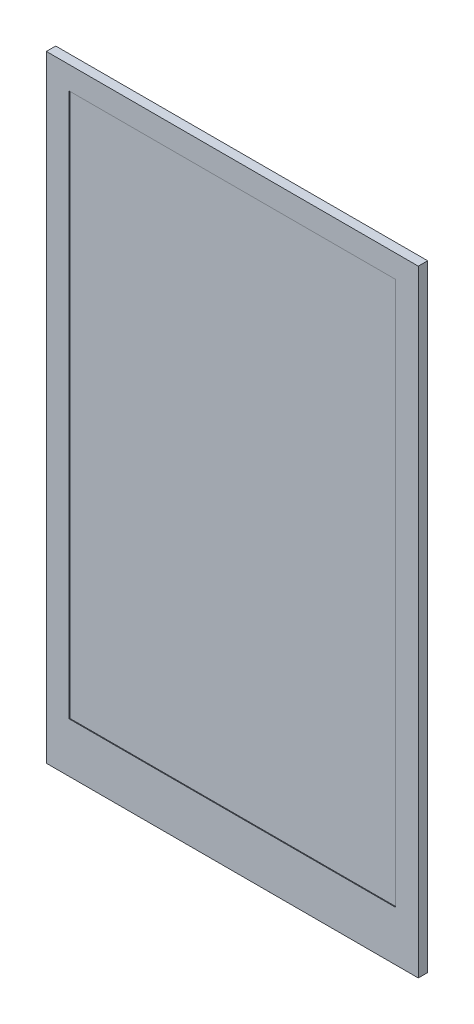
ISO-10303-21;
HEADER;
FILE_DESCRIPTION(('STEP AP214'),'2;1');
FILE_NAME('part.step','',(''),(''),'','','');
FILE_SCHEMA(('AUTOMOTIVE_DESIGN { 1 0 10303 214 1 1 1 1 }'));
ENDSEC;
DATA;
#1=APPLICATION_CONTEXT('core data for automotive mechanical design processes');
#2=APPLICATION_PROTOCOL_DEFINITION('international standard','automotive_design',2000,#1);
#3=PRODUCT_CONTEXT('',#1,'mechanical');
#4=PRODUCT('Part','Part','',(#3));
#5=PRODUCT_RELATED_PRODUCT_CATEGORY('part','',(#4));
#6=PRODUCT_DEFINITION_FORMATION('','',#4);
#7=PRODUCT_DEFINITION_CONTEXT('part definition',#1,'design');
#8=PRODUCT_DEFINITION('design','',#6,#7);
#9=PRODUCT_DEFINITION_SHAPE('','',#8);
#10=(LENGTH_UNIT() NAMED_UNIT(*) SI_UNIT(.MILLI.,.METRE.));
#11=(NAMED_UNIT(*) PLANE_ANGLE_UNIT() SI_UNIT($,.RADIAN.));
#12=(NAMED_UNIT(*) SI_UNIT($,.STERADIAN.) SOLID_ANGLE_UNIT());
#13=UNCERTAINTY_MEASURE_WITH_UNIT(LENGTH_MEASURE(1.E-05),#10,'distance_accuracy_value','');
#14=(GEOMETRIC_REPRESENTATION_CONTEXT(3) GLOBAL_UNCERTAINTY_ASSIGNED_CONTEXT((#13)) GLOBAL_UNIT_ASSIGNED_CONTEXT((#10,
#11,#12)) REPRESENTATION_CONTEXT('',''));
#15=CARTESIAN_POINT('',(0.,0.,0.));
#16=DIRECTION('',(0.,0.,1.));
#17=DIRECTION('',(1.,0.,0.));
#18=AXIS2_PLACEMENT_3D('',#15,#16,#17);
#19=CARTESIAN_POINT('',(97.8104028868791,41.3133748002331,183.6));
#20=DIRECTION('',(0.,0.,-1.));
#21=DIRECTION('',(-1.,0.,0.));
#22=AXIS2_PLACEMENT_3D('',#19,#20,#21);
#23=PLANE('',#22);
#24=DIRECTION('',(-3.91342339985403E-06,-0.999999999992343,0.));
#25=VECTOR('',#24,1.);
#26=CARTESIAN_POINT('',(50.2002485026905,80.773561078885,183.6));
#27=LINE('',#26,#25);
#28=CARTESIAN_POINT('',(50.2004028872437,120.223561076083,183.6));
#29=VERTEX_POINT('',#28);
#30=CARTESIAN_POINT('',(50.2000941206374,41.3235610791869,183.6));
#31=VERTEX_POINT('',#30);
#32=EDGE_CURVE('E78',#29,#31,#27,.T.);
#33=ORIENTED_EDGE('',*,*,#32,.F.);
#34=DIRECTION('',(-0.999999999992343,3.91342339355777E-06,0.));
#35=VECTOR('',#34,1.);
#36=CARTESIAN_POINT('',(74.0004028870614,120.223467939106,183.6));
#37=LINE('',#36,#35);
#38=CARTESIAN_POINT('',(97.8004028868791,120.223374797129,183.6));
#39=VERTEX_POINT('',#38);
#40=EDGE_CURVE('E80',#39,#29,#37,.T.);
#41=ORIENTED_EDGE('',*,*,#40,.F.);
#42=DIRECTION('',(3.91342339950234E-06,0.999999999992343,0.));
#43=VECTOR('',#42,1.);
#44=CARTESIAN_POINT('',(97.800248502326,80.7733747999311,183.6));
#45=LINE('',#44,#43);
#46=CARTESIAN_POINT('',(97.8000941177729,41.3233748027331,183.6));
#47=VERTEX_POINT('',#46);
#48=EDGE_CURVE('E72',#47,#39,#45,.T.);
#49=ORIENTED_EDGE('',*,*,#48,.F.);
#50=DIRECTION('',(0.999999999992343,-3.91342339982346E-06,0.));
#51=VECTOR('',#50,1.);
#52=CARTESIAN_POINT('',(74.0000941179552,41.32346793971,183.6));
#53=LINE('',#52,#51);
#54=EDGE_CURVE('E132',#31,#47,#53,.T.);
#55=ORIENTED_EDGE('',*,*,#54,.F.);
#56=EDGE_LOOP('',(#33,#41,#49,#55));
#57=FACE_BOUND('',#56,.T.);
#58=ADVANCED_FACE('F17',(#57),#23,.T.);
#59=CARTESIAN_POINT('',(97.8000940786387,41.3133748002332,183.59));
#60=DIRECTION('',(0.999999999992343,-3.91342339950234E-06,0.));
#61=DIRECTION('',(3.91342339950234E-06,0.999999999992343,0.));
#62=AXIS2_PLACEMENT_3D('',#59,#60,#61);
#63=PLANE('',#62);
#64=DIRECTION('',(3.91342339906128E-06,0.999999999992343,0.));
#65=VECTOR('',#64,1.);
#66=CARTESIAN_POINT('',(97.8000941177729,41.3233748002331,184.8));
#67=LINE('',#66,#65);
#68=CARTESIAN_POINT('',(97.8000941177729,41.3233748002331,184.8));
#69=VERTEX_POINT('',#68);
#70=CARTESIAN_POINT('',(97.8004028868791,120.223374799629,184.8));
#71=VERTEX_POINT('',#70);
#72=EDGE_CURVE('E21',#69,#71,#67,.T.);
#73=ORIENTED_EDGE('',*,*,#72,.F.);
#74=DIRECTION('',(0.,0.,1.));
#75=VECTOR('',#74,1.);
#76=CARTESIAN_POINT('',(97.8000941177729,41.3233748002331,184.2));
#77=LINE('',#76,#75);
#78=EDGE_CURVE('E88',#47,#69,#77,.T.);
#79=ORIENTED_EDGE('',*,*,#78,.F.);
#80=ORIENTED_EDGE('',*,*,#48,.T.);
#81=DIRECTION('',(0.,0.,-1.));
#82=VECTOR('',#81,1.);
#83=CARTESIAN_POINT('',(97.8004028868791,120.223374799629,184.2));
#84=LINE('',#83,#82);
#85=EDGE_CURVE('E84',#71,#39,#84,.T.);
#86=ORIENTED_EDGE('',*,*,#85,.F.);
#87=EDGE_LOOP('',(#73,#79,#80,#86));
#88=FACE_BOUND('',#87,.T.);
#89=ADVANCED_FACE('F86',(#88),#63,.T.);
#90=CARTESIAN_POINT('',(97.8104028868791,120.223374760495,183.59));
#91=DIRECTION('',(3.91342339355777E-06,0.999999999992343,0.));
#92=DIRECTION('',(-0.999999999992343,3.91342339355777E-06,0.));
#93=AXIS2_PLACEMENT_3D('',#90,#91,#92);
#94=PLANE('',#93);
#95=DIRECTION('',(-0.999999999992343,3.91342340361155E-06,0.));
#96=VECTOR('',#95,1.);
#97=CARTESIAN_POINT('',(97.8004028868791,120.223374799629,184.8));
#98=LINE('',#97,#96);
#99=CARTESIAN_POINT('',(50.2004028872437,120.223561078583,184.8));
#100=VERTEX_POINT('',#99);
#101=EDGE_CURVE('E93',#71,#100,#98,.T.);
#102=ORIENTED_EDGE('',*,*,#101,.F.);
#103=ORIENTED_EDGE('',*,*,#85,.T.);
#104=ORIENTED_EDGE('',*,*,#40,.T.);
#105=DIRECTION('',(0.,0.,-1.));
#106=VECTOR('',#105,1.);
#107=CARTESIAN_POINT('',(50.2004028872437,120.223561078583,184.2));
#108=LINE('',#107,#106);
#109=EDGE_CURVE('E95',#100,#29,#108,.T.);
#110=ORIENTED_EDGE('',*,*,#109,.F.);
#111=EDGE_LOOP('',(#102,#103,#104,#110));
#112=FACE_BOUND('',#111,.T.);
#113=ADVANCED_FACE('F91',(#112),#94,.T.);
#114=CARTESIAN_POINT('',(50.2004029263779,120.233561078583,183.59));
#115=DIRECTION('',(-0.999999999992343,3.91342339985403E-06,0.));
#116=DIRECTION('',(-3.91342339985403E-06,-0.999999999992343,0.));
#117=AXIS2_PLACEMENT_3D('',#114,#115,#116);
#118=PLANE('',#117);
#119=DIRECTION('',(-3.91342340055634E-06,-0.999999999992343,0.));
#120=VECTOR('',#119,1.);
#121=CARTESIAN_POINT('',(50.2004028872437,120.223561078583,184.8));
#122=LINE('',#121,#120);
#123=CARTESIAN_POINT('',(50.2000941181374,41.3235610791869,184.8));
#124=VERTEX_POINT('',#123);
#125=EDGE_CURVE('E125',#100,#124,#122,.T.);
#126=ORIENTED_EDGE('',*,*,#125,.F.);
#127=ORIENTED_EDGE('',*,*,#109,.T.);
#128=ORIENTED_EDGE('',*,*,#32,.T.);
#129=DIRECTION('',(0.,0.,-1.));
#130=VECTOR('',#129,1.);
#131=CARTESIAN_POINT('',(50.2000941181374,41.323561079187,184.2));
#132=LINE('',#131,#130);
#133=EDGE_CURVE('E128',#124,#31,#132,.T.);
#134=ORIENTED_EDGE('',*,*,#133,.F.);
#135=EDGE_LOOP('',(#126,#127,#128,#134));
#136=FACE_BOUND('',#135,.T.);
#137=ADVANCED_FACE('F224',(#136),#118,.T.);
#138=CARTESIAN_POINT('',(50.1900941181375,41.3235611183212,183.59));
#139=DIRECTION('',(-3.91342339996918E-06,-0.999999999992343,0.));
#140=DIRECTION('',(0.999999999992343,-3.91342339996918E-06,0.));
#141=AXIS2_PLACEMENT_3D('',#138,#139,#140);
#142=PLANE('',#141);
#143=DIRECTION('',(0.999999999992343,-3.91342339909251E-06,0.));
#144=VECTOR('',#143,1.);
#145=CARTESIAN_POINT('',(50.2000941181374,41.3235610791869,184.8));
#146=LINE('',#145,#144);
#147=EDGE_CURVE('E122',#124,#69,#146,.T.);
#148=ORIENTED_EDGE('',*,*,#147,.F.);
#149=ORIENTED_EDGE('',*,*,#133,.T.);
#150=ORIENTED_EDGE('',*,*,#54,.T.);
#151=ORIENTED_EDGE('',*,*,#78,.T.);
#152=EDGE_LOOP('',(#148,#149,#150,#151));
#153=FACE_BOUND('',#152,.T.);
#154=ADVANCED_FACE('F215',(#153),#142,.T.);
#155=CARTESIAN_POINT('',(50.1900941181374,41.3133748002331,184.8));
#156=DIRECTION('',(0.,0.,1.));
#157=DIRECTION('',(1.,0.,0.));
#158=AXIS2_PLACEMENT_3D('',#155,#156,#157);
#159=PLANE('',#158);
#160=DIRECTION('',(-0.999999999992343,3.91342340859762E-06,0.));
#161=VECTOR('',#160,1.);
#162=CARTESIAN_POINT('',(74.0003914598651,117.303467939128,184.8));
#163=LINE('',#162,#161);
#164=CARTESIAN_POINT('',(94.8803914572052,117.303386226848,184.8));
#165=VERTEX_POINT('',#164);
#166=CARTESIAN_POINT('',(53.1203914600249,117.303549650159,184.8));
#167=VERTEX_POINT('',#166);
#168=EDGE_CURVE('E113',#165,#167,#163,.T.);
#169=ORIENTED_EDGE('',*,*,#168,.F.);
#170=DIRECTION('',(3.91342339809995E-06,0.999999999992342,0.));
#171=VECTOR('',#170,1.);
#172=CARTESIAN_POINT('',(94.8802552725709,82.5033862271143,184.8));
#173=LINE('',#172,#171);
#174=CARTESIAN_POINT('',(94.8801190841866,47.7033862273806,184.8));
#175=VERTEX_POINT('',#174);
#176=EDGE_CURVE('E106',#175,#165,#173,.T.);
#177=ORIENTED_EDGE('',*,*,#176,.F.);
#178=DIRECTION('',(0.999999999992343,-3.91342339896487E-06,0.));
#179=VECTOR('',#178,1.);
#180=CARTESIAN_POINT('',(74.0001190855965,47.7034679396612,184.8));
#181=LINE('',#180,#179);
#182=CARTESIAN_POINT('',(53.1201190870064,47.7035496519417,184.8));
#183=VERTEX_POINT('',#182);
#184=EDGE_CURVE('E103',#183,#175,#181,.T.);
#185=ORIENTED_EDGE('',*,*,#184,.F.);
#186=DIRECTION('',(-3.91342339989398E-06,-0.999999999992343,0.));
#187=VECTOR('',#186,1.);
#188=CARTESIAN_POINT('',(53.1202552728906,82.5035496516754,184.8));
#189=LINE('',#188,#187);
#190=EDGE_CURVE('E104',#167,#183,#189,.T.);
#191=ORIENTED_EDGE('',*,*,#190,.F.);
#192=EDGE_LOOP('',(#169,#177,#185,#191));
#193=FACE_BOUND('',#192,.T.);
#194=ORIENTED_EDGE('',*,*,#125,.T.);
#195=ORIENTED_EDGE('',*,*,#147,.T.);
#196=ORIENTED_EDGE('',*,*,#72,.T.);
#197=ORIENTED_EDGE('',*,*,#101,.T.);
#198=EDGE_LOOP('',(#194,#195,#196,#197));
#199=FACE_BOUND('',#198,.T.);
#200=ADVANCED_FACE('F151',(#193,#199),#159,.T.);
#201=CARTESIAN_POINT('',(53.110391460025,117.303549690543,184.69));
#202=DIRECTION('',(-3.91342340859762E-06,-0.999999999992343,0.));
#203=DIRECTION('',(0.999999999992343,-3.91342340859762E-06,0.));
#204=AXIS2_PLACEMENT_3D('',#201,#202,#203);
#205=PLANE('',#204);
#206=ORIENTED_EDGE('',*,*,#168,.T.);
#207=DIRECTION('',(0.,0.,1.));
#208=VECTOR('',#207,1.);
#209=CARTESIAN_POINT('',(53.120391460025,117.303549651409,184.75));
#210=LINE('',#209,#208);
#211=CARTESIAN_POINT('',(53.1203914600249,117.303549651409,184.7));
#212=VERTEX_POINT('',#211);
#213=EDGE_CURVE('E111',#212,#167,#210,.T.);
#214=ORIENTED_EDGE('',*,*,#213,.F.);
#215=DIRECTION('',(-0.999999999992343,3.9134233954727E-06,0.));
#216=VECTOR('',#215,1.);
#217=CARTESIAN_POINT('',(94.8803914597052,117.303386226848,184.7));
#218=LINE('',#217,#216);
#219=CARTESIAN_POINT('',(94.8803914597052,117.303386226848,184.7));
#220=VERTEX_POINT('',#219);
#221=EDGE_CURVE('E110',#220,#212,#218,.T.);
#222=ORIENTED_EDGE('',*,*,#221,.F.);
#223=DIRECTION('',(0.,0.,-1.));
#224=VECTOR('',#223,1.);
#225=CARTESIAN_POINT('',(94.8803914597052,117.303386226848,184.75));
#226=LINE('',#225,#224);
#227=EDGE_CURVE('E107',#165,#220,#226,.T.);
#228=ORIENTED_EDGE('',*,*,#227,.F.);
#229=EDGE_LOOP('',(#206,#214,#222,#228));
#230=FACE_BOUND('',#229,.T.);
#231=ADVANCED_FACE('F157',(#230),#205,.T.);
#232=CARTESIAN_POINT('',(53.1201190466221,47.6935496519418,184.69));
#233=DIRECTION('',(0.999999999992343,-3.91342339979431E-06,0.));
#234=DIRECTION('',(3.91342339979431E-06,0.999999999992343,0.));
#235=AXIS2_PLACEMENT_3D('',#232,#233,#234);
#236=PLANE('',#235);
#237=ORIENTED_EDGE('',*,*,#190,.T.);
#238=DIRECTION('',(0.,0.,1.));
#239=VECTOR('',#238,1.);
#240=CARTESIAN_POINT('',(53.1201190857564,47.7035496519418,184.75));
#241=LINE('',#240,#239);
#242=CARTESIAN_POINT('',(53.1201190857564,47.7035496519417,184.7));
#243=VERTEX_POINT('',#242);
#244=EDGE_CURVE('E100',#243,#183,#241,.T.);
#245=ORIENTED_EDGE('',*,*,#244,.F.);
#246=DIRECTION('',(-3.91342339789865E-06,-0.999999999992343,0.));
#247=VECTOR('',#246,1.);
#248=CARTESIAN_POINT('',(53.1203914600249,117.303549651409,184.7));
#249=LINE('',#248,#247);
#250=EDGE_CURVE('E117',#212,#243,#249,.T.);
#251=ORIENTED_EDGE('',*,*,#250,.F.);
#252=ORIENTED_EDGE('',*,*,#213,.T.);
#253=EDGE_LOOP('',(#237,#245,#251,#252));
#254=FACE_BOUND('',#253,.T.);
#255=ADVANCED_FACE('F160',(#254),#236,.T.);
#256=CARTESIAN_POINT('',(94.8901190854365,47.7033861882464,184.69));
#257=DIRECTION('',(3.91342339896487E-06,0.999999999992343,0.));
#258=DIRECTION('',(-0.999999999992343,3.91342339896487E-06,0.));
#259=AXIS2_PLACEMENT_3D('',#256,#257,#258);
#260=PLANE('',#259);
#261=ORIENTED_EDGE('',*,*,#184,.T.);
#262=DIRECTION('',(0.,0.,1.));
#263=VECTOR('',#262,1.);
#264=CARTESIAN_POINT('',(94.8801190854366,47.7033862273806,184.75));
#265=LINE('',#264,#263);
#266=CARTESIAN_POINT('',(94.8801190854366,47.7033862273806,184.7));
#267=VERTEX_POINT('',#266);
#268=EDGE_CURVE('E36',#267,#175,#265,.T.);
#269=ORIENTED_EDGE('',*,*,#268,.F.);
#270=DIRECTION('',(0.999999999992343,-3.91342339796513E-06,0.));
#271=VECTOR('',#270,1.);
#272=CARTESIAN_POINT('',(53.1201190857564,47.7035496519417,184.7));
#273=LINE('',#272,#271);
#274=EDGE_CURVE('E27',#243,#267,#273,.T.);
#275=ORIENTED_EDGE('',*,*,#274,.F.);
#276=ORIENTED_EDGE('',*,*,#244,.T.);
#277=EDGE_LOOP('',(#261,#269,#275,#276));
#278=FACE_BOUND('',#277,.T.);
#279=ADVANCED_FACE('F162',(#278),#260,.T.);
#280=CARTESIAN_POINT('',(94.8803914988394,117.313386226848,184.69));
#281=DIRECTION('',(-0.999999999992343,3.91342339809995E-06,0.));
#282=DIRECTION('',(-3.91342339809995E-06,-0.999999999992343,0.));
#283=AXIS2_PLACEMENT_3D('',#280,#281,#282);
#284=PLANE('',#283);
#285=ORIENTED_EDGE('',*,*,#176,.T.);
#286=ORIENTED_EDGE('',*,*,#227,.T.);
#287=DIRECTION('',(3.91342339939409E-06,0.999999999992342,0.));
#288=VECTOR('',#287,1.);
#289=CARTESIAN_POINT('',(94.8801190854366,47.7033862273806,184.7));
#290=LINE('',#289,#288);
#291=EDGE_CURVE('E11',#267,#220,#290,.T.);
#292=ORIENTED_EDGE('',*,*,#291,.F.);
#293=ORIENTED_EDGE('',*,*,#268,.T.);
#294=EDGE_LOOP('',(#285,#286,#292,#293));
#295=FACE_BOUND('',#294,.T.);
#296=ADVANCED_FACE('F144',(#295),#284,.T.);
#297=CARTESIAN_POINT('',(53.1101190857564,47.6933862273806,184.7));
#298=DIRECTION('',(0.,0.,1.));
#299=DIRECTION('',(1.,0.,0.));
#300=AXIS2_PLACEMENT_3D('',#297,#298,#299);
#301=PLANE('',#300);
#302=ORIENTED_EDGE('',*,*,#274,.T.);
#303=ORIENTED_EDGE('',*,*,#291,.T.);
#304=ORIENTED_EDGE('',*,*,#221,.T.);
#305=ORIENTED_EDGE('',*,*,#250,.T.);
#306=EDGE_LOOP('',(#302,#303,#304,#305));
#307=FACE_BOUND('',#306,.T.);
#308=ADVANCED_FACE('F19',(#307),#301,.T.);
#309=CLOSED_SHELL('',(#58,#89,#113,#137,#154,#200,#231,#255,#279,#296,#308));
#310=MANIFOLD_SOLID_BREP('B1',#309);
#311=ADVANCED_BREP_SHAPE_REPRESENTATION('',(#18,#310),#14);
#312=SHAPE_DEFINITION_REPRESENTATION(#9,#311);
ENDSEC;
END-ISO-10303-21;
